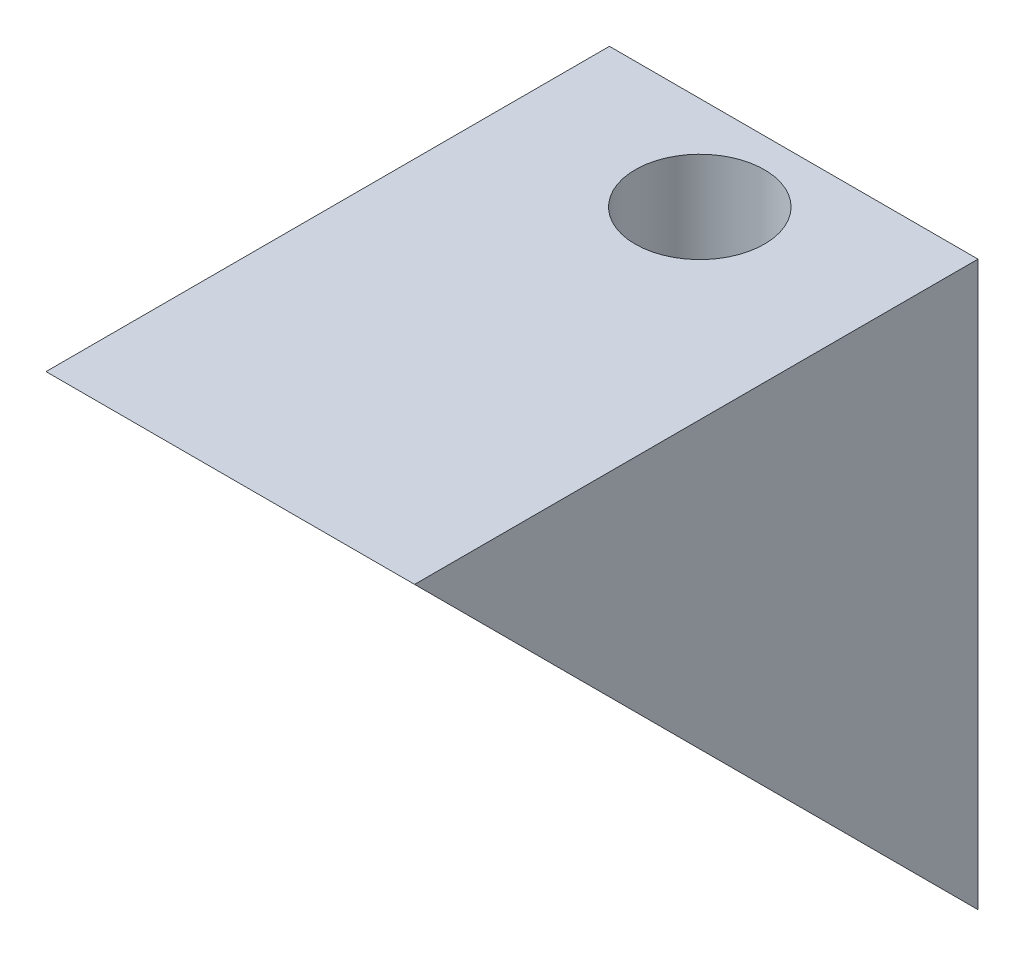
ISO-10303-21;
HEADER;
FILE_DESCRIPTION(('STEP AP214'),'2;1');
FILE_NAME('part.step','',(''),(''),'','','');
FILE_SCHEMA(('AUTOMOTIVE_DESIGN { 1 0 10303 214 1 1 1 1 }'));
ENDSEC;
DATA;
#1=APPLICATION_CONTEXT('core data for automotive mechanical design processes');
#2=APPLICATION_PROTOCOL_DEFINITION('international standard','automotive_design',2000,#1);
#3=PRODUCT_CONTEXT('',#1,'mechanical');
#4=PRODUCT('Part','Part','',(#3));
#5=PRODUCT_RELATED_PRODUCT_CATEGORY('part','',(#4));
#6=PRODUCT_DEFINITION_FORMATION('','',#4);
#7=PRODUCT_DEFINITION_CONTEXT('part definition',#1,'design');
#8=PRODUCT_DEFINITION('design','',#6,#7);
#9=PRODUCT_DEFINITION_SHAPE('','',#8);
#10=(LENGTH_UNIT() NAMED_UNIT(*) SI_UNIT(.MILLI.,.METRE.));
#11=(NAMED_UNIT(*) PLANE_ANGLE_UNIT() SI_UNIT($,.RADIAN.));
#12=(NAMED_UNIT(*) SI_UNIT($,.STERADIAN.) SOLID_ANGLE_UNIT());
#13=UNCERTAINTY_MEASURE_WITH_UNIT(LENGTH_MEASURE(1.E-05),#10,'distance_accuracy_value','');
#14=(GEOMETRIC_REPRESENTATION_CONTEXT(3) GLOBAL_UNCERTAINTY_ASSIGNED_CONTEXT((#13)) GLOBAL_UNIT_ASSIGNED_CONTEXT((#10,
#11,#12)) REPRESENTATION_CONTEXT('',''));
#15=CARTESIAN_POINT('',(0.,0.,0.));
#16=DIRECTION('',(0.,0.,1.));
#17=DIRECTION('',(1.,0.,0.));
#18=AXIS2_PLACEMENT_3D('',#15,#16,#17);
#19=CARTESIAN_POINT('',(39.25,-24.35604681,100.));
#20=DIRECTION('',(0.,-1.,0.));
#21=DIRECTION('',(0.,0.,-1.));
#22=AXIS2_PLACEMENT_3D('',#19,#20,#21);
#23=PLANE('',#22);
#24=CARTESIAN_POINT('',(0.,-24.35604681,0.));
#25=DIRECTION('',(0.,1.,0.));
#26=DIRECTION('',(0.,0.,1.));
#27=AXIS2_PLACEMENT_3D('',#24,#25,#26);
#28=CIRCLE('',#27,13.75);
#29=CARTESIAN_POINT('',(0.,-24.35604681,13.75));
#30=VERTEX_POINT('',#29);
#31=EDGE_CURVE('E100',#30,#30,#28,.T.);
#32=ORIENTED_EDGE('',*,*,#31,.F.);
#33=EDGE_LOOP('',(#32));
#34=FACE_BOUND('',#33,.T.);
#35=DIRECTION('',(0.,0.,1.));
#36=VECTOR('',#35,1.);
#37=CARTESIAN_POINT('',(-39.25,-24.35604681,100.));
#38=LINE('',#37,#36);
#39=CARTESIAN_POINT('',(-39.25,-24.35604681,-20.));
#40=VERTEX_POINT('',#39);
#41=CARTESIAN_POINT('',(-39.25,-24.35604681,100.));
#42=VERTEX_POINT('',#41);
#43=EDGE_CURVE('E93',#40,#42,#38,.T.);
#44=ORIENTED_EDGE('',*,*,#43,.T.);
#45=DIRECTION('',(-1.,0.,0.));
#46=VECTOR('',#45,1.);
#47=CARTESIAN_POINT('',(39.25,-24.35604681,100.));
#48=LINE('',#47,#46);
#49=CARTESIAN_POINT('',(39.25,-24.35604681,100.));
#50=VERTEX_POINT('',#49);
#51=EDGE_CURVE('E12',#50,#42,#48,.T.);
#52=ORIENTED_EDGE('',*,*,#51,.F.);
#53=DIRECTION('',(0.,0.,1.));
#54=VECTOR('',#53,1.);
#55=CARTESIAN_POINT('',(39.25,-24.35604681,100.));
#56=LINE('',#55,#54);
#57=CARTESIAN_POINT('',(39.25,-24.35604681,-20.));
#58=VERTEX_POINT('',#57);
#59=EDGE_CURVE('E86',#58,#50,#56,.T.);
#60=ORIENTED_EDGE('',*,*,#59,.F.);
#61=DIRECTION('',(-1.,0.,0.));
#62=VECTOR('',#61,1.);
#63=CARTESIAN_POINT('',(39.25,-24.35604681,-20.));
#64=LINE('',#63,#62);
#65=EDGE_CURVE('E94',#58,#40,#64,.T.);
#66=ORIENTED_EDGE('',*,*,#65,.T.);
#67=EDGE_LOOP('',(#44,#52,#60,#66));
#68=FACE_BOUND('',#67,.T.);
#69=ADVANCED_FACE('F39',(#34,#68),#23,.F.);
#70=CARTESIAN_POINT('',(39.25,-24.35604681,100.));
#71=DIRECTION('',(0.,0.707106781186549,-0.707106781186546));
#72=DIRECTION('',(0.,0.707106781186546,0.707106781186549));
#73=AXIS2_PLACEMENT_3D('',#70,#71,#72);
#74=PLANE('',#73);
#75=DIRECTION('',(0.,-0.707106781186546,-0.707106781186549));
#76=VECTOR('',#75,1.);
#77=CARTESIAN_POINT('',(-39.25,-24.35604681,100.));
#78=LINE('',#77,#76);
#79=CARTESIAN_POINT('',(-39.25,-144.35604681,-20.));
#80=VERTEX_POINT('',#79);
#81=EDGE_CURVE('E74',#42,#80,#78,.T.);
#82=ORIENTED_EDGE('',*,*,#81,.T.);
#83=DIRECTION('',(-1.,0.,0.));
#84=VECTOR('',#83,1.);
#85=CARTESIAN_POINT('',(39.25,-144.35604681,-20.));
#86=LINE('',#85,#84);
#87=CARTESIAN_POINT('',(39.25,-144.35604681,-20.));
#88=VERTEX_POINT('',#87);
#89=EDGE_CURVE('E53',#88,#80,#86,.T.);
#90=ORIENTED_EDGE('',*,*,#89,.F.);
#91=DIRECTION('',(0.,-0.707106781186546,-0.707106781186549));
#92=VECTOR('',#91,1.);
#93=CARTESIAN_POINT('',(39.25,-24.35604681,100.));
#94=LINE('',#93,#92);
#95=EDGE_CURVE('E82',#50,#88,#94,.T.);
#96=ORIENTED_EDGE('',*,*,#95,.F.);
#97=ORIENTED_EDGE('',*,*,#51,.T.);
#98=EDGE_LOOP('',(#82,#90,#96,#97));
#99=FACE_BOUND('',#98,.T.);
#100=ADVANCED_FACE('F83',(#99),#74,.F.);
#101=CARTESIAN_POINT('',(39.25,-24.35604681,-20.));
#102=DIRECTION('',(0.,0.,1.));
#103=DIRECTION('',(0.,-1.,0.));
#104=AXIS2_PLACEMENT_3D('',#101,#102,#103);
#105=PLANE('',#104);
#106=CARTESIAN_POINT('',(0.,-59.35604681,-20.));
#107=DIRECTION('',(0.,0.,-1.));
#108=DIRECTION('',(0.,1.,0.));
#109=AXIS2_PLACEMENT_3D('',#106,#107,#108);
#110=CIRCLE('',#109,3.5);
#111=CARTESIAN_POINT('',(0.,-55.85604681,-20.));
#112=VERTEX_POINT('',#111);
#113=EDGE_CURVE('E112',#112,#112,#110,.T.);
#114=ORIENTED_EDGE('',*,*,#113,.F.);
#115=EDGE_LOOP('',(#114));
#116=FACE_BOUND('',#115,.T.);
#117=CARTESIAN_POINT('',(0.,-74.35604681,-20.));
#118=DIRECTION('',(0.,0.,-1.));
#119=DIRECTION('',(0.,1.,0.));
#120=AXIS2_PLACEMENT_3D('',#117,#118,#119);
#121=CIRCLE('',#120,3.50000000000001);
#122=CARTESIAN_POINT('',(0.,-70.85604681,-20.));
#123=VERTEX_POINT('',#122);
#124=EDGE_CURVE('E190',#123,#123,#121,.T.);
#125=ORIENTED_EDGE('',*,*,#124,.F.);
#126=EDGE_LOOP('',(#125));
#127=FACE_BOUND('',#126,.T.);
#128=DIRECTION('',(0.,1.,0.));
#129=VECTOR('',#128,1.);
#130=CARTESIAN_POINT('',(-39.25,-24.35604681,-20.));
#131=LINE('',#130,#129);
#132=EDGE_CURVE('E79',#80,#40,#131,.T.);
#133=ORIENTED_EDGE('',*,*,#132,.T.);
#134=ORIENTED_EDGE('',*,*,#65,.F.);
#135=DIRECTION('',(0.,1.,0.));
#136=VECTOR('',#135,1.);
#137=CARTESIAN_POINT('',(39.25,-24.35604681,-20.));
#138=LINE('',#137,#136);
#139=EDGE_CURVE('E62',#88,#58,#138,.T.);
#140=ORIENTED_EDGE('',*,*,#139,.F.);
#141=ORIENTED_EDGE('',*,*,#89,.T.);
#142=EDGE_LOOP('',(#133,#134,#140,#141));
#143=FACE_BOUND('',#142,.T.);
#144=ADVANCED_FACE('F156',(#116,#127,#143),#105,.F.);
#145=CARTESIAN_POINT('',(39.25,0.,0.));
#146=DIRECTION('',(-1.,0.,0.));
#147=DIRECTION('',(0.,0.,1.));
#148=AXIS2_PLACEMENT_3D('',#145,#146,#147);
#149=PLANE('',#148);
#150=ORIENTED_EDGE('',*,*,#59,.T.);
#151=ORIENTED_EDGE('',*,*,#95,.T.);
#152=ORIENTED_EDGE('',*,*,#139,.T.);
#153=EDGE_LOOP('',(#150,#151,#152));
#154=FACE_BOUND('',#153,.T.);
#155=ADVANCED_FACE('F89',(#154),#149,.F.);
#156=CARTESIAN_POINT('',(-39.25,0.,0.));
#157=DIRECTION('',(-1.,0.,0.));
#158=DIRECTION('',(0.,0.,1.));
#159=AXIS2_PLACEMENT_3D('',#156,#157,#158);
#160=PLANE('',#159);
#161=ORIENTED_EDGE('',*,*,#43,.F.);
#162=ORIENTED_EDGE('',*,*,#132,.F.);
#163=ORIENTED_EDGE('',*,*,#81,.F.);
#164=EDGE_LOOP('',(#161,#162,#163));
#165=FACE_BOUND('',#164,.T.);
#166=ADVANCED_FACE('F163',(#165),#160,.T.);
#167=CARTESIAN_POINT('',(0.,-54.35604681,0.));
#168=DIRECTION('',(0.,1.,0.));
#169=DIRECTION('',(0.,0.,1.));
#170=AXIS2_PLACEMENT_3D('',#167,#168,#169);
#171=CYLINDRICAL_SURFACE('',#170,13.75);
#172=CARTESIAN_POINT('',(0.,-54.35604681,0.));
#173=DIRECTION('',(0.,1.,0.));
#174=DIRECTION('',(0.,0.,1.));
#175=AXIS2_PLACEMENT_3D('',#172,#173,#174);
#176=CIRCLE('',#175,13.75);
#177=CARTESIAN_POINT('',(0.,-54.35604681,13.75));
#178=VERTEX_POINT('',#177);
#179=EDGE_CURVE('E96',#178,#178,#176,.T.);
#180=ORIENTED_EDGE('',*,*,#179,.F.);
#181=EDGE_LOOP('',(#180));
#182=FACE_BOUND('',#181,.T.);
#183=ORIENTED_EDGE('',*,*,#31,.T.);
#184=EDGE_LOOP('',(#183));
#185=FACE_BOUND('',#184,.T.);
#186=ADVANCED_FACE('F150',(#182,#185),#171,.F.);
#187=CARTESIAN_POINT('',(0.,-54.35604681,0.));
#188=DIRECTION('',(0.,1.,0.));
#189=DIRECTION('',(0.,0.,1.));
#190=AXIS2_PLACEMENT_3D('',#187,#188,#189);
#191=PLANE('',#190);
#192=CARTESIAN_POINT('',(0.,-54.35604681,0.));
#193=DIRECTION('',(0.,1.,0.));
#194=DIRECTION('',(0.,0.,1.));
#195=AXIS2_PLACEMENT_3D('',#192,#193,#194);
#196=CIRCLE('',#195,10.2);
#197=CARTESIAN_POINT('',(0.,-54.35604681,10.2));
#198=VERTEX_POINT('',#197);
#199=EDGE_CURVE('E142',#198,#198,#196,.T.);
#200=ORIENTED_EDGE('',*,*,#199,.F.);
#201=EDGE_LOOP('',(#200));
#202=FACE_BOUND('',#201,.T.);
#203=ORIENTED_EDGE('',*,*,#179,.T.);
#204=EDGE_LOOP('',(#203));
#205=FACE_BOUND('',#204,.T.);
#206=ADVANCED_FACE('F126',(#202,#205),#191,.T.);
#207=CARTESIAN_POINT('',(0.,-84.35604681,0.));
#208=DIRECTION('',(0.,1.,0.));
#209=DIRECTION('',(0.,0.,1.));
#210=AXIS2_PLACEMENT_3D('',#207,#208,#209);
#211=PLANE('',#210);
#212=CARTESIAN_POINT('',(0.,-84.35604681,0.));
#213=DIRECTION('',(0.,1.,0.));
#214=DIRECTION('',(0.,0.,1.));
#215=AXIS2_PLACEMENT_3D('',#212,#213,#214);
#216=CIRCLE('',#215,9.75);
#217=CARTESIAN_POINT('',(0.,-84.35604681,9.75));
#218=VERTEX_POINT('',#217);
#219=EDGE_CURVE('E135',#218,#218,#216,.T.);
#220=ORIENTED_EDGE('',*,*,#219,.T.);
#221=EDGE_LOOP('',(#220));
#222=FACE_BOUND('',#221,.T.);
#223=ADVANCED_FACE('F123',(#222),#211,.T.);
#224=CARTESIAN_POINT('',(0.,-84.35604681,0.));
#225=DIRECTION('',(0.,1.,0.));
#226=DIRECTION('',(0.,0.,1.));
#227=AXIS2_PLACEMENT_3D('',#224,#225,#226);
#228=CONICAL_SURFACE('',#227,9.75,0.0149988751518505);
#229=CARTESIAN_POINT('',(-2.59179033824031,-61.7081996202154,-9.75115512473475));
#230=CARTESIAN_POINT('',(-2.72165791023341,-61.5651019435198,-9.71886002024729));
#231=CARTESIAN_POINT('',(-2.83971423466014,-61.4111770812255,-9.68711203801604));
#232=CARTESIAN_POINT('',(-3.0491161868953,-61.0853156034374,-9.62838371516953));
#233=CARTESIAN_POINT('',(-3.14047031115816,-60.9133847410315,-9.60140185908968));
#234=CARTESIAN_POINT('',(-3.29388345319786,-60.5553539011636,-9.55554570127963));
#235=CARTESIAN_POINT('',(-3.355872096112,-60.3692211144541,-9.53669088577535));
#236=CARTESIAN_POINT('',(-3.44794969407772,-59.9884754552975,-9.50986823990022));
#237=CARTESIAN_POINT('',(-3.47804903562372,-59.7938653654616,-9.50189686449776));
#238=CARTESIAN_POINT('',(-3.50465602082454,-59.4100514736196,-9.4982505806644));
#239=CARTESIAN_POINT('',(-3.50245256862876,-59.2209406529561,-9.50209903697074));
#240=CARTESIAN_POINT('',(-3.46776207246521,-58.846088739943,-9.52079711475306));
#241=CARTESIAN_POINT('',(-3.43527497556245,-58.6603476534843,-9.5356467554588));
#242=CARTESIAN_POINT('',(-3.34196428543835,-58.2998801593343,-9.57446780593904));
#243=CARTESIAN_POINT('',(-3.28152758976343,-58.1250392269434,-9.59831387591376));
#244=CARTESIAN_POINT('',(-3.13443799194301,-57.7878785027128,-9.65266396858952));
#245=CARTESIAN_POINT('',(-3.04777852322253,-57.6255618599347,-9.68316965842548));
#246=CARTESIAN_POINT('',(-2.84549126475843,-57.3090379207442,-9.74953305371695));
#247=CARTESIAN_POINT('',(-2.72860289675916,-57.1556769680199,-9.78558531952425));
#248=CARTESIAN_POINT('',(-2.47132855339704,-56.8701907799867,-9.85811688445665));
#249=CARTESIAN_POINT('',(-2.33093570732374,-56.738071776219,-9.89459630553722));
#250=CARTESIAN_POINT('',(-2.02379526594572,-56.4934765638297,-9.96579248188664));
#251=CARTESIAN_POINT('',(-1.85621472723916,-56.3820042344351,-10.0003793126318));
#252=CARTESIAN_POINT('',(-1.503396273569,-56.188997142742,-10.0623900106738));
#253=CARTESIAN_POINT('',(-1.31816225710315,-56.1074557898579,-10.0898154544721));
#254=CARTESIAN_POINT('',(-0.940737560878732,-55.9791261268149,-10.1338038638839));
#255=CARTESIAN_POINT('',(-0.748896043584253,-55.931412828759,-10.1506543679912));
#256=CARTESIAN_POINT('',(-0.35929086322261,-55.8689572866098,-10.17283063183));
#257=CARTESIAN_POINT('',(-0.161529430921476,-55.8542027774792,-10.1781606786744));
#258=CARTESIAN_POINT('',(0.223332933149659,-55.8581563918009,-10.176743960832));
#259=CARTESIAN_POINT('',(0.410456052983656,-55.8751727434569,-10.1706077504438));
#260=CARTESIAN_POINT('',(0.778965941997026,-55.9387127528249,-10.1480817605142));
#261=CARTESIAN_POINT('',(0.960352716408456,-55.9852363836228,-10.1316919903254));
#262=CARTESIAN_POINT('',(1.31229140288824,-56.1060499804841,-10.0903156244046));
#263=CARTESIAN_POINT('',(1.48285607420815,-56.1803065100519,-10.0653393839226));
#264=CARTESIAN_POINT('',(1.80933233149589,-56.354287979051,-10.0091571871403));
#265=CARTESIAN_POINT('',(1.9652402597798,-56.4540192529076,-9.9779496818261));
#266=CARTESIAN_POINT('',(2.26635102151521,-56.6819000611578,-9.91050715702737));
#267=CARTESIAN_POINT('',(2.41062842928933,-56.8112214617052,-9.87409875152193));
#268=CARTESIAN_POINT('',(2.67595590840095,-57.0918535696171,-9.80116089330351));
#269=CARTESIAN_POINT('',(2.79699875560538,-57.2431710904414,-9.76463140652338));
#270=CARTESIAN_POINT('',(3.01665029505525,-57.5700085088313,-9.69394032358892));
#271=CARTESIAN_POINT('',(3.11431105774972,-57.7461964470834,-9.65990865960483));
#272=CARTESIAN_POINT('',(3.27832029428394,-58.1138339868895,-9.59966617983028));
#273=CARTESIAN_POINT('',(3.34467857995714,-58.305278784122,-9.57345291429345));
#274=CARTESIAN_POINT('',(3.44185951830412,-58.6913127736203,-9.53278249483609));
#275=CARTESIAN_POINT('',(3.47379999190146,-58.8855808296879,-9.51796033469392));
#276=CARTESIAN_POINT('',(3.50461625737914,-59.2772344676575,-9.50039819317544));
#277=CARTESIAN_POINT('',(3.50350450288947,-59.474618847354,-9.49765366156045));
#278=CARTESIAN_POINT('',(3.46915143386168,-59.8556788274151,-9.50416471713567));
#279=CARTESIAN_POINT('',(3.43762869540814,-60.0395236946482,-9.51278743768138));
#280=CARTESIAN_POINT('',(3.34607742645599,-60.3992231197836,-9.53965493150372));
#281=CARTESIAN_POINT('',(3.28604586428531,-60.5750768257139,-9.55790072813586));
#282=CARTESIAN_POINT('',(3.13859333966178,-60.9162281491191,-9.60194995022092));
#283=CARTESIAN_POINT('',(3.05087062346762,-61.0813840732724,-9.6278364248272));
#284=CARTESIAN_POINT('',(2.85073527011117,-61.3951547766805,-9.68407274735248));
#285=CARTESIAN_POINT('',(2.73831544855812,-61.5437647237145,-9.71442389319424));
#286=CARTESIAN_POINT('',(2.48472128845999,-61.8287998974637,-9.77803831335541));
#287=CARTESIAN_POINT('',(2.34230790490136,-61.9641095617676,-9.81137000385075));
#288=CARTESIAN_POINT('',(2.03652697132106,-62.2092847391763,-9.87561238966425));
#289=CARTESIAN_POINT('',(1.87315682210803,-62.3191470913936,-9.90652278391064));
#290=CARTESIAN_POINT('',(1.52701189014711,-62.5116768086357,-9.96286706199989));
#291=CARTESIAN_POINT('',(1.34399093797071,-62.5939285052842,-9.9882154061691));
#292=CARTESIAN_POINT('',(0.965673213313481,-62.7261490379817,-10.0298620752953));
#293=CARTESIAN_POINT('',(0.770380579114954,-62.7761286934465,-10.0461634330567));
#294=CARTESIAN_POINT('',(0.381889804402021,-62.8404811449354,-10.0672916382581));
#295=CARTESIAN_POINT('',(0.188949957377607,-62.8562651338323,-10.0725729042852));
#296=CARTESIAN_POINT('',(-0.196860256523282,-62.8558240171117,-10.072425609909));
#297=CARTESIAN_POINT('',(-0.389730629376017,-62.8396058912126,-10.0669993848288));
#298=CARTESIAN_POINT('',(-0.763894667200073,-62.776774877096,-10.0463804880134));
#299=CARTESIAN_POINT('',(-0.945362050071947,-62.7310891598311,-10.0314859287137));
#300=CARTESIAN_POINT('',(-1.29801605827119,-62.6117853100839,-9.99378430562933));
#301=CARTESIAN_POINT('',(-1.46919905452105,-62.5381573838454,-9.97097446777635));
#302=CARTESIAN_POINT('',(-1.81341787582325,-62.356554134743,-9.91720940413334));
#303=CARTESIAN_POINT('',(-1.98494797519349,-62.2458930412955,-9.88567005929488));
#304=CARTESIAN_POINT('',(-2.30593044013812,-61.9968752608159,-9.81960486873872));
#305=CARTESIAN_POINT('',(-2.45537640044913,-61.8585105659521,-9.78507816115485));
#306=CARTESIAN_POINT('',(-2.59179033824031,-61.7081996202154,-9.75115512473475));
#307=B_SPLINE_CURVE_WITH_KNOTS('',3,(#229,#230,#231,#232,#233,#234,#235,#236,#237,#238,#239,
#240,#241,#242,#243,#244,#245,#246,#247,#248,#249,#250,#251,#252,#253,#254,#255,#256,#257,#258,
#259,#260,#261,#262,#263,#264,#265,#266,#267,#268,#269,#270,#271,#272,#273,#274,#275,#276,#277,
#278,#279,#280,#281,#282,#283,#284,#285,#286,#287,#288,#289,#290,#291,#292,#293,#294,#295,#296,
#297,#298,#299,#300,#301,#302,#303,#304,#305,#306),.UNSPECIFIED.,.T.,.F.,(4,2,2,2,2,2,2,2,2,2,2,
2,2,2,2,2,2,2,2,2,2,2,2,2,2,2,2,2,2,2,2,2,2,2,2,2,2,2,4),(0.,0.587079845679323,1.17397268276733,
1.7622649906255,2.35036562997048,2.91506677991495,3.47976891694355,4.03687784642589,
4.59412639993897,5.1800330153774,5.76611120007941,6.37576384842142,6.98528217499344,
7.57741387862419,8.16932519405461,8.73061262282972,9.29189953964621,9.85251190750697,
10.4132638104277,11.002061861379,11.5910426870376,12.2009128310918,12.8105916827098,
13.3998100520921,13.9888064148214,14.5463560822747,15.1039650536967,15.6678732704155,
16.2319457458286,16.826960252396,17.422048627928,18.0257313526805,18.6292115835717,
19.2072712938571,19.7852049422203,20.3457870988795,20.9065659215625,21.5230608355201,
22.1397342076165),.UNSPECIFIED.);
#308=CARTESIAN_POINT('',(-2.59179033824031,-61.7081996202154,-9.75115512473475));
#309=VERTEX_POINT('',#308);
#310=EDGE_CURVE('E42',#309,#309,#307,.T.);
#311=ORIENTED_EDGE('',*,*,#310,.T.);
#312=EDGE_LOOP('',(#311));
#313=FACE_BOUND('',#312,.T.);
#314=CARTESIAN_POINT('',(-2.56109489305756,-76.7415851032903,-9.52594186965576));
#315=CARTESIAN_POINT('',(-2.69297490580488,-76.6000010398315,-9.49268640616942));
#316=CARTESIAN_POINT('',(-2.8131367244075,-76.4474305303275,-9.45983242175268));
#317=CARTESIAN_POINT('',(-3.02692000817769,-76.1239036078721,-9.39871204925553));
#318=CARTESIAN_POINT('',(-3.12055084368181,-75.9529537157361,-9.37044404298955));
#319=CARTESIAN_POINT('',(-3.27865634914517,-75.5964180830135,-9.32197729879886));
#320=CARTESIAN_POINT('',(-3.34305766695297,-75.4107968786772,-9.30179887650354));
#321=CARTESIAN_POINT('',(-3.43997935170656,-75.0305765995913,-9.27248144268394));
#322=CARTESIAN_POINT('',(-3.47251090643088,-74.8359807005162,-9.26333855690805));
#323=CARTESIAN_POINT('',(-3.50375353983877,-74.4521347393179,-9.25772116309116));
#324=CARTESIAN_POINT('',(-3.50382355343247,-74.2630019581556,-9.2607322957416));
#325=CARTESIAN_POINT('',(-3.47363040207479,-73.8877216423632,-9.27810965828314));
#326=CARTESIAN_POINT('',(-3.44336766411847,-73.7015740657479,-9.29247572832982));
#327=CARTESIAN_POINT('',(-3.354538496497,-73.3406449117302,-9.33065523495575));
#328=CARTESIAN_POINT('',(-3.29646416037032,-73.1657235348714,-9.35430317441528));
#329=CARTESIAN_POINT('',(-3.15416735444544,-72.8280336322801,-9.40857793479422));
#330=CARTESIAN_POINT('',(-3.06993831433255,-72.6652681729911,-9.43920650880167));
#331=CARTESIAN_POINT('',(-2.87257210163815,-72.3472766685868,-9.50616777105542));
#332=CARTESIAN_POINT('',(-2.75815142294499,-72.1928925947192,-9.54271525526767));
#333=CARTESIAN_POINT('',(-2.50573466301164,-71.9049293291762,-9.61654285242));
#334=CARTESIAN_POINT('',(-2.36773114887884,-71.7713567223603,-9.65382319305497));
#335=CARTESIAN_POINT('',(-2.06467982956526,-71.5228218470521,-9.72705968300491));
#336=CARTESIAN_POINT('',(-1.89870422830506,-71.4089473119422,-9.76288383194456));
#337=CARTESIAN_POINT('',(-1.54863967905561,-71.2108708714878,-9.82749601840848));
#338=CARTESIAN_POINT('',(-1.36455447502923,-71.1266628493379,-9.85628550600249));
#339=CARTESIAN_POINT('',(-0.988581529818947,-70.9927999216796,-9.90298019805917));
#340=CARTESIAN_POINT('',(-0.797040397036268,-70.942270527897,-9.92115920528262));
#341=CARTESIAN_POINT('',(-0.407469292405867,-70.8742334554541,-9.94579414109061));
#342=CARTESIAN_POINT('',(-0.209441948259039,-70.8567125686514,-9.95225475867505));
#343=CARTESIAN_POINT('',(0.175862469063155,-70.8554534103849,-9.95271864782422));
#344=CARTESIAN_POINT('',(0.363135584233085,-70.8699211671429,-9.94738344746913));
#345=CARTESIAN_POINT('',(0.732366714658558,-70.9284271065626,-9.92615157836453));
#346=CARTESIAN_POINT('',(0.914324805347783,-70.9724648693378,-9.91025505958303));
#347=CARTESIAN_POINT('',(1.26725047922156,-71.0882582358793,-9.86957299225187));
#348=CARTESIAN_POINT('',(1.43826019440053,-71.1598990729098,-9.844824279071));
#349=CARTESIAN_POINT('',(1.7660337576691,-71.3286505182041,-9.78876938728551));
#350=CARTESIAN_POINT('',(1.92279410488499,-71.425767362921,-9.75746160341776));
#351=CARTESIAN_POINT('',(2.22619552548619,-71.648421335131,-9.68944080540422));
#352=CARTESIAN_POINT('',(2.37191724182651,-71.7751521276514,-9.65253393516183));
#353=CARTESIAN_POINT('',(2.64058206968053,-72.0507517022222,-9.57823878087025));
#354=CARTESIAN_POINT('',(2.76351744536906,-72.1996279717223,-9.54085033792036));
#355=CARTESIAN_POINT('',(2.98794624109685,-72.5223876970022,-9.46794702478764));
#356=CARTESIAN_POINT('',(3.0884008073463,-72.6970266892688,-9.43256450946932));
#357=CARTESIAN_POINT('',(3.25824866349443,-73.0620954590035,-9.36945845485689));
#358=CARTESIAN_POINT('',(3.32765120110604,-73.2525205151175,-9.34173263623806));
#359=CARTESIAN_POINT('',(3.43105168335276,-73.6374924926647,-9.29809030709968));
#360=CARTESIAN_POINT('',(3.46610881289336,-73.8317139363772,-9.28182516306528));
#361=CARTESIAN_POINT('',(3.50303900248026,-74.2238899598214,-9.26166508459216));
#362=CARTESIAN_POINT('',(3.50492601694745,-74.4218429346375,-9.25776494885237));
#363=CARTESIAN_POINT('',(3.47622410542451,-74.8037364032772,-9.26245636339724));
#364=CARTESIAN_POINT('',(3.44749300859445,-74.9878290255629,-9.27034376800636));
#365=CARTESIAN_POINT('',(3.36146873436942,-75.3484690102073,-9.29612752070288));
#366=CARTESIAN_POINT('',(3.30417272773988,-75.5250156232843,-9.31402486025377));
#367=CARTESIAN_POINT('',(3.16233034865492,-75.8674400155904,-9.35771365414145));
#368=CARTESIAN_POINT('',(3.07756196654617,-76.0332171956033,-9.38356933276783));
#369=CARTESIAN_POINT('',(2.88333637586477,-76.3487117019602,-9.44010828389503));
#370=CARTESIAN_POINT('',(2.77387185154134,-76.4984242500388,-9.47079298608368));
#371=CARTESIAN_POINT('',(2.52596618060307,-76.7866146579636,-9.53552542903428));
#372=CARTESIAN_POINT('',(2.38622123698592,-76.923952302708,-9.56966509766052));
#373=CARTESIAN_POINT('',(2.08548836014745,-77.1736601670049,-9.63583778385864));
#374=CARTESIAN_POINT('',(1.92449712929972,-77.286026503491,-9.66787047324844));
#375=CARTESIAN_POINT('',(1.58203926007444,-77.4844674781531,-9.72681384024253));
#376=CARTESIAN_POINT('',(1.4002491526063,-77.570017737866,-9.75361889589889));
#377=CARTESIAN_POINT('',(1.02373951672341,-77.7089837506828,-9.79819019364288));
#378=CARTESIAN_POINT('',(0.829024426196122,-77.7624104709121,-9.81595952025033));
#379=CARTESIAN_POINT('',(0.441067556294544,-77.8335003610461,-9.83979311786739));
#380=CARTESIAN_POINT('',(0.248115460970819,-77.8525882125646,-9.84632316040549));
#381=CARTESIAN_POINT('',(-0.138319583807564,-77.858644274005,-9.84838370917031));
#382=CARTESIAN_POINT('',(-0.331802386993977,-77.8456205891208,-9.84391699106274));
#383=CARTESIAN_POINT('',(-0.706968486525819,-77.7889723111587,-9.82483516785599));
#384=CARTESIAN_POINT('',(-0.888829600352053,-77.7463960023511,-9.81056788070846));
#385=CARTESIAN_POINT('',(-1.24276245263201,-77.6332545419792,-9.77375720877809));
#386=CARTESIAN_POINT('',(-1.4148304035281,-77.5626786444134,-9.75121064672823));
#387=CARTESIAN_POINT('',(-1.76401087789665,-77.3860343156201,-9.69717068276463));
#388=CARTESIAN_POINT('',(-1.93941866158191,-77.276812452468,-9.66494556615344));
#389=CARTESIAN_POINT('',(-2.26798665295949,-77.0297195253503,-9.59697765541334));
#390=CARTESIAN_POINT('',(-2.42113938681628,-76.8918388746108,-9.56123368628939));
#391=CARTESIAN_POINT('',(-2.56109489305756,-76.7415851032903,-9.52594186965576));
#392=B_SPLINE_CURVE_WITH_KNOTS('',3,(#314,#315,#316,#317,#318,#319,#320,#321,#322,#323,#324,
#325,#326,#327,#328,#329,#330,#331,#332,#333,#334,#335,#336,#337,#338,#339,#340,#341,#342,#343,
#344,#345,#346,#347,#348,#349,#350,#351,#352,#353,#354,#355,#356,#357,#358,#359,#360,#361,#362,
#363,#364,#365,#366,#367,#368,#369,#370,#371,#372,#373,#374,#375,#376,#377,#378,#379,#380,#381,
#382,#383,#384,#385,#386,#387,#388,#389,#390,#391),.UNSPECIFIED.,.T.,.F.,(4,2,2,2,2,2,2,2,2,2,2,
2,2,2,2,2,2,2,2,2,2,2,2,2,2,2,2,2,2,2,2,2,2,2,2,2,2,2,4),(0.,0.58828582439468,1.17636361553955,
1.76590915039961,2.35524765294297,2.91991239933137,3.48456919702841,4.03958477378838,
4.59473988878047,5.17898492996882,5.7634144556462,6.37375648271636,6.98397259234706,
7.5776530250391,8.17109584981599,8.73210553212282,9.29310724840641,9.85180119943673,
10.4106320449667,10.9978677130346,11.585302380367,12.1959423503743,12.8064003423169,
13.3973767800786,13.988104592492,14.5449259572247,15.1018024837393,15.6632964003906,
16.2249568675787,16.8188976764444,17.412930779245,18.0179442206371,18.6227509901751,
19.2018295910215,19.7807620430265,20.3401432248213,20.8997393003117,21.5238389011003,
22.1481476090883),.UNSPECIFIED.);
#393=CARTESIAN_POINT('',(-2.56109489305756,-76.7415851032903,-9.52594186965576));
#394=VERTEX_POINT('',#393);
#395=EDGE_CURVE('E106',#394,#394,#392,.T.);
#396=ORIENTED_EDGE('',*,*,#395,.T.);
#397=EDGE_LOOP('',(#396));
#398=FACE_BOUND('',#397,.T.);
#399=ORIENTED_EDGE('',*,*,#219,.F.);
#400=EDGE_LOOP('',(#399));
#401=FACE_BOUND('',#400,.T.);
#402=ORIENTED_EDGE('',*,*,#199,.T.);
#403=EDGE_LOOP('',(#402));
#404=FACE_BOUND('',#403,.T.);
#405=ADVANCED_FACE('F113',(#313,#398,#401,#404),#228,.F.);
#406=CARTESIAN_POINT('',(0.,-74.35604681,-5.00000000000002));
#407=DIRECTION('',(0.,0.,-1.));
#408=DIRECTION('',(0.,1.,0.));
#409=AXIS2_PLACEMENT_3D('',#406,#407,#408);
#410=CYLINDRICAL_SURFACE('',#409,3.50000000000001);
#411=ORIENTED_EDGE('',*,*,#124,.T.);
#412=EDGE_LOOP('',(#411));
#413=FACE_BOUND('',#412,.T.);
#414=ORIENTED_EDGE('',*,*,#395,.F.);
#415=EDGE_LOOP('',(#414));
#416=FACE_BOUND('',#415,.T.);
#417=ADVANCED_FACE('F117',(#413,#416),#410,.F.);
#418=CARTESIAN_POINT('',(0.,-59.35604681,-5.00000000000002));
#419=DIRECTION('',(0.,0.,-1.));
#420=DIRECTION('',(0.,1.,0.));
#421=AXIS2_PLACEMENT_3D('',#418,#419,#420);
#422=CYLINDRICAL_SURFACE('',#421,3.5);
#423=ORIENTED_EDGE('',*,*,#113,.T.);
#424=EDGE_LOOP('',(#423));
#425=FACE_BOUND('',#424,.T.);
#426=ORIENTED_EDGE('',*,*,#310,.F.);
#427=EDGE_LOOP('',(#426));
#428=FACE_BOUND('',#427,.T.);
#429=ADVANCED_FACE('F120',(#425,#428),#422,.F.);
#430=CLOSED_SHELL('',(#69,#100,#144,#155,#166,#186,#206,#223,#405,#417,#429));
#431=MANIFOLD_SOLID_BREP('B2',#430);
#432=ADVANCED_BREP_SHAPE_REPRESENTATION('',(#18,#431),#14);
#433=SHAPE_DEFINITION_REPRESENTATION(#9,#432);
ENDSEC;
END-ISO-10303-21;
